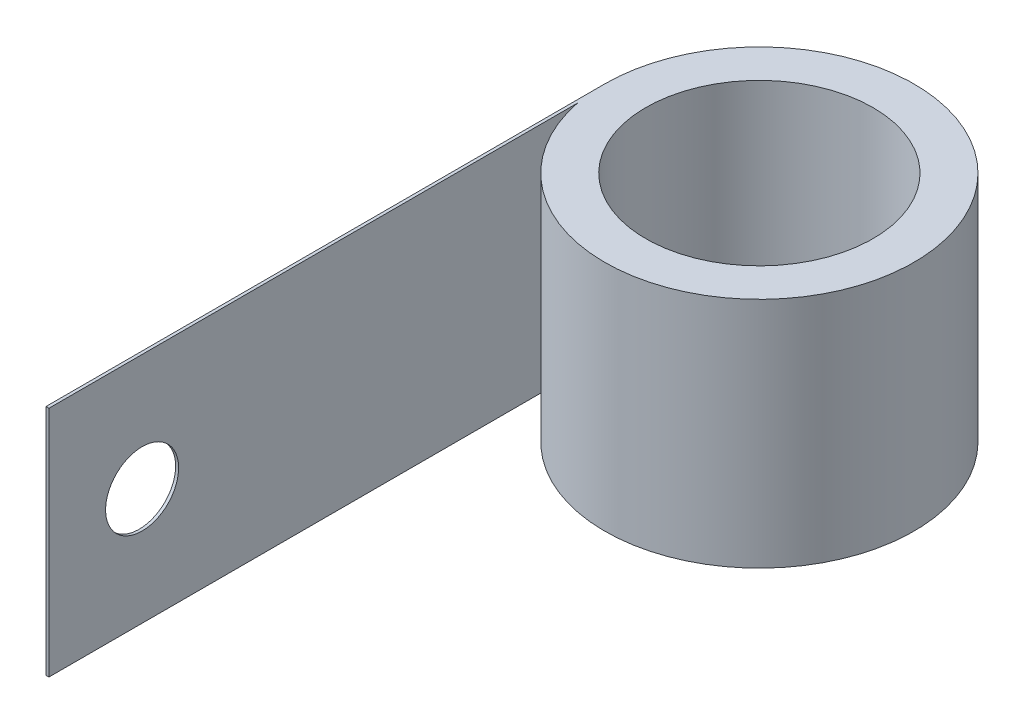
ISO-10303-21;
HEADER;
FILE_DESCRIPTION(('STEP AP214'),'2;1');
FILE_NAME('part.step','',(''),(''),'','','');
FILE_SCHEMA(('AUTOMOTIVE_DESIGN { 1 0 10303 214 1 1 1 1 }'));
ENDSEC;
DATA;
#1=APPLICATION_CONTEXT('core data for automotive mechanical design processes');
#2=APPLICATION_PROTOCOL_DEFINITION('international standard','automotive_design',2000,#1);
#3=PRODUCT_CONTEXT('',#1,'mechanical');
#4=PRODUCT('Part','Part','',(#3));
#5=PRODUCT_RELATED_PRODUCT_CATEGORY('part','',(#4));
#6=PRODUCT_DEFINITION_FORMATION('','',#4);
#7=PRODUCT_DEFINITION_CONTEXT('part definition',#1,'design');
#8=PRODUCT_DEFINITION('design','',#6,#7);
#9=PRODUCT_DEFINITION_SHAPE('','',#8);
#10=(LENGTH_UNIT() NAMED_UNIT(*) SI_UNIT(.MILLI.,.METRE.));
#11=(NAMED_UNIT(*) PLANE_ANGLE_UNIT() SI_UNIT($,.RADIAN.));
#12=(NAMED_UNIT(*) SI_UNIT($,.STERADIAN.) SOLID_ANGLE_UNIT());
#13=UNCERTAINTY_MEASURE_WITH_UNIT(LENGTH_MEASURE(1.E-05),#10,'distance_accuracy_value','');
#14=(GEOMETRIC_REPRESENTATION_CONTEXT(3) GLOBAL_UNCERTAINTY_ASSIGNED_CONTEXT((#13)) GLOBAL_UNIT_ASSIGNED_CONTEXT((#10,
#11,#12)) REPRESENTATION_CONTEXT('',''));
#15=CARTESIAN_POINT('',(0.,0.,0.));
#16=DIRECTION('',(0.,0.,1.));
#17=DIRECTION('',(1.,0.,0.));
#18=AXIS2_PLACEMENT_3D('',#15,#16,#17);
#19=CARTESIAN_POINT('',(0.,15.875,0.));
#20=DIRECTION('',(0.,-1.,0.));
#21=DIRECTION('',(0.,0.,-1.));
#22=AXIS2_PLACEMENT_3D('',#19,#20,#21);
#23=CYLINDRICAL_SURFACE('',#22,7.747);
#24=CARTESIAN_POINT('',(0.,0.,0.));
#25=DIRECTION('',(0.,-1.,0.));
#26=DIRECTION('',(0.,0.,-1.));
#27=AXIS2_PLACEMENT_3D('',#24,#25,#26);
#28=CIRCLE('',#27,7.747);
#29=CARTESIAN_POINT('',(0.,0.,-7.747));
#30=VERTEX_POINT('',#29);
#31=EDGE_CURVE('E88',#30,#30,#28,.T.);
#32=ORIENTED_EDGE('',*,*,#31,.T.);
#33=EDGE_LOOP('',(#32));
#34=FACE_BOUND('',#33,.T.);
#35=CARTESIAN_POINT('',(0.,15.875,0.));
#36=DIRECTION('',(0.,-1.,0.));
#37=DIRECTION('',(0.,0.,-1.));
#38=AXIS2_PLACEMENT_3D('',#35,#36,#37);
#39=CIRCLE('',#38,7.747);
#40=CARTESIAN_POINT('',(0.,15.875,-7.747));
#41=VERTEX_POINT('',#40);
#42=EDGE_CURVE('E120',#41,#41,#39,.T.);
#43=ORIENTED_EDGE('',*,*,#42,.F.);
#44=EDGE_LOOP('',(#43));
#45=FACE_BOUND('',#44,.T.);
#46=ADVANCED_FACE('F16',(#34,#45),#23,.F.);
#47=CARTESIAN_POINT('',(-10.541,7.9375,31.75));
#48=DIRECTION('',(1.,0.,0.));
#49=DIRECTION('',(0.,0.,-1.));
#50=AXIS2_PLACEMENT_3D('',#47,#48,#49);
#51=CYLINDRICAL_SURFACE('',#50,2.4892);
#52=CARTESIAN_POINT('',(-10.3378,7.9375,31.75));
#53=DIRECTION('',(1.,0.,0.));
#54=DIRECTION('',(0.,0.,-1.));
#55=AXIS2_PLACEMENT_3D('',#52,#53,#54);
#56=CIRCLE('',#55,2.4892);
#57=CARTESIAN_POINT('',(-10.3378,7.9375,29.2608));
#58=VERTEX_POINT('',#57);
#59=EDGE_CURVE('E115',#58,#58,#56,.T.);
#60=ORIENTED_EDGE('',*,*,#59,.T.);
#61=EDGE_LOOP('',(#60));
#62=FACE_BOUND('',#61,.T.);
#63=CARTESIAN_POINT('',(-10.541,7.9375,31.75));
#64=DIRECTION('',(1.,0.,0.));
#65=DIRECTION('',(0.,0.,-1.));
#66=AXIS2_PLACEMENT_3D('',#63,#64,#65);
#67=CIRCLE('',#66,2.4892);
#68=CARTESIAN_POINT('',(-10.541,7.9375,29.2608));
#69=VERTEX_POINT('',#68);
#70=EDGE_CURVE('E82',#69,#69,#67,.F.);
#71=ORIENTED_EDGE('',*,*,#70,.T.);
#72=EDGE_LOOP('',(#71));
#73=FACE_BOUND('',#72,.T.);
#74=ADVANCED_FACE('F160',(#62,#73),#51,.F.);
#75=CARTESIAN_POINT('',(-10.541,15.875,38.1));
#76=DIRECTION('',(0.,0.,-1.));
#77=DIRECTION('',(-1.,0.,0.));
#78=AXIS2_PLACEMENT_3D('',#75,#76,#77);
#79=PLANE('',#78);
#80=DIRECTION('',(0.,1.,0.));
#81=VECTOR('',#80,1.);
#82=CARTESIAN_POINT('',(-10.3378,15.875,38.1));
#83=LINE('',#82,#81);
#84=CARTESIAN_POINT('',(-10.3378,0.,38.1));
#85=VERTEX_POINT('',#84);
#86=CARTESIAN_POINT('',(-10.3378,15.875,38.1));
#87=VERTEX_POINT('',#86);
#88=EDGE_CURVE('E64',#85,#87,#83,.T.);
#89=ORIENTED_EDGE('',*,*,#88,.T.);
#90=DIRECTION('',(1.,0.,0.));
#91=VECTOR('',#90,1.);
#92=CARTESIAN_POINT('',(0.,15.875,38.1));
#93=LINE('',#92,#91);
#94=CARTESIAN_POINT('',(-10.541,15.875,38.1));
#95=VERTEX_POINT('',#94);
#96=EDGE_CURVE('E76',#95,#87,#93,.T.);
#97=ORIENTED_EDGE('',*,*,#96,.F.);
#98=DIRECTION('',(0.,1.,0.));
#99=VECTOR('',#98,1.);
#100=CARTESIAN_POINT('',(-10.541,15.875,38.1));
#101=LINE('',#100,#99);
#102=CARTESIAN_POINT('',(-10.541,0.,38.1));
#103=VERTEX_POINT('',#102);
#104=EDGE_CURVE('E72',#95,#103,#101,.F.);
#105=ORIENTED_EDGE('',*,*,#104,.T.);
#106=DIRECTION('',(1.,0.,0.));
#107=VECTOR('',#106,1.);
#108=CARTESIAN_POINT('',(0.,0.,38.1));
#109=LINE('',#108,#107);
#110=EDGE_CURVE('E75',#103,#85,#109,.T.);
#111=ORIENTED_EDGE('',*,*,#110,.T.);
#112=EDGE_LOOP('',(#89,#97,#105,#111));
#113=FACE_BOUND('',#112,.T.);
#114=ADVANCED_FACE('F74',(#113),#79,.F.);
#115=CARTESIAN_POINT('',(0.,0.,0.));
#116=DIRECTION('',(0.,1.,0.));
#117=DIRECTION('',(0.,0.,1.));
#118=AXIS2_PLACEMENT_3D('',#115,#116,#117);
#119=PLANE('',#118);
#120=ORIENTED_EDGE('',*,*,#31,.F.);
#121=EDGE_LOOP('',(#120));
#122=FACE_BOUND('',#121,.T.);
#123=DIRECTION('',(0.,0.,1.));
#124=VECTOR('',#123,1.);
#125=CARTESIAN_POINT('',(-10.3378,0.,38.1));
#126=LINE('',#125,#124);
#127=CARTESIAN_POINT('',(-10.3378,0.,2.05975050916371));
#128=VERTEX_POINT('',#127);
#129=EDGE_CURVE('E86',#128,#85,#126,.T.);
#130=ORIENTED_EDGE('',*,*,#129,.T.);
#131=ORIENTED_EDGE('',*,*,#110,.F.);
#132=DIRECTION('',(0.,0.,-1.));
#133=VECTOR('',#132,1.);
#134=CARTESIAN_POINT('',(-10.541,0.,0.));
#135=LINE('',#134,#133);
#136=CARTESIAN_POINT('',(-10.541,0.,0.));
#137=VERTEX_POINT('',#136);
#138=EDGE_CURVE('E81',#103,#137,#135,.T.);
#139=ORIENTED_EDGE('',*,*,#138,.T.);
#140=CARTESIAN_POINT('',(0.,0.,0.));
#141=DIRECTION('',(0.,-1.,0.));
#142=DIRECTION('',(0.,0.,-1.));
#143=AXIS2_PLACEMENT_3D('',#140,#141,#142);
#144=CIRCLE('',#143,10.541);
#145=EDGE_CURVE('E52',#128,#137,#144,.F.);
#146=ORIENTED_EDGE('',*,*,#145,.F.);
#147=EDGE_LOOP('',(#130,#131,#139,#146));
#148=FACE_BOUND('',#147,.T.);
#149=ADVANCED_FACE('F84',(#122,#148),#119,.F.);
#150=CARTESIAN_POINT('',(-10.541,15.875,0.));
#151=DIRECTION('',(1.,0.,0.));
#152=DIRECTION('',(0.,0.,-1.));
#153=AXIS2_PLACEMENT_3D('',#150,#151,#152);
#154=PLANE('',#153);
#155=ORIENTED_EDGE('',*,*,#104,.F.);
#156=DIRECTION('',(0.,0.,1.));
#157=VECTOR('',#156,1.);
#158=CARTESIAN_POINT('',(-10.541,15.875,0.));
#159=LINE('',#158,#157);
#160=CARTESIAN_POINT('',(-10.541,15.875,0.));
#161=VERTEX_POINT('',#160);
#162=EDGE_CURVE('E95',#161,#95,#159,.T.);
#163=ORIENTED_EDGE('',*,*,#162,.F.);
#164=DIRECTION('',(0.,-1.,0.));
#165=VECTOR('',#164,1.);
#166=CARTESIAN_POINT('',(-10.541,15.875,0.));
#167=LINE('',#166,#165);
#168=EDGE_CURVE('E93',#137,#161,#167,.F.);
#169=ORIENTED_EDGE('',*,*,#168,.F.);
#170=ORIENTED_EDGE('',*,*,#138,.F.);
#171=EDGE_LOOP('',(#155,#163,#169,#170));
#172=FACE_BOUND('',#171,.T.);
#173=ORIENTED_EDGE('',*,*,#70,.F.);
#174=EDGE_LOOP('',(#173));
#175=FACE_BOUND('',#174,.T.);
#176=ADVANCED_FACE('F90',(#172,#175),#154,.F.);
#177=CARTESIAN_POINT('',(0.,15.875,0.));
#178=DIRECTION('',(0.,1.,0.));
#179=DIRECTION('',(0.,0.,1.));
#180=AXIS2_PLACEMENT_3D('',#177,#178,#179);
#181=PLANE('',#180);
#182=ORIENTED_EDGE('',*,*,#42,.T.);
#183=EDGE_LOOP('',(#182));
#184=FACE_BOUND('',#183,.T.);
#185=ORIENTED_EDGE('',*,*,#96,.T.);
#186=DIRECTION('',(0.,0.,1.));
#187=VECTOR('',#186,1.);
#188=CARTESIAN_POINT('',(-10.3378,15.875,38.1));
#189=LINE('',#188,#187);
#190=CARTESIAN_POINT('',(-10.3378,15.875,2.05975050916371));
#191=VERTEX_POINT('',#190);
#192=EDGE_CURVE('E39',#87,#191,#189,.F.);
#193=ORIENTED_EDGE('',*,*,#192,.T.);
#194=CARTESIAN_POINT('',(0.,15.875,0.));
#195=DIRECTION('',(0.,-1.,0.));
#196=DIRECTION('',(0.,0.,-1.));
#197=AXIS2_PLACEMENT_3D('',#194,#195,#196);
#198=CIRCLE('',#197,10.541);
#199=EDGE_CURVE('E26',#161,#191,#198,.T.);
#200=ORIENTED_EDGE('',*,*,#199,.F.);
#201=ORIENTED_EDGE('',*,*,#162,.T.);
#202=EDGE_LOOP('',(#185,#193,#200,#201));
#203=FACE_BOUND('',#202,.T.);
#204=ADVANCED_FACE('F157',(#184,#203),#181,.T.);
#205=CARTESIAN_POINT('',(-10.3378,15.875,38.1));
#206=DIRECTION('',(-1.,0.,0.));
#207=DIRECTION('',(0.,0.,1.));
#208=AXIS2_PLACEMENT_3D('',#205,#206,#207);
#209=PLANE('',#208);
#210=DIRECTION('',(0.,-1.,0.));
#211=VECTOR('',#210,1.);
#212=CARTESIAN_POINT('',(-10.3378,15.875,2.05975050916371));
#213=LINE('',#212,#211);
#214=EDGE_CURVE('E11',#191,#128,#213,.T.);
#215=ORIENTED_EDGE('',*,*,#214,.F.);
#216=ORIENTED_EDGE('',*,*,#192,.F.);
#217=ORIENTED_EDGE('',*,*,#88,.F.);
#218=ORIENTED_EDGE('',*,*,#129,.F.);
#219=EDGE_LOOP('',(#215,#216,#217,#218));
#220=FACE_BOUND('',#219,.T.);
#221=ORIENTED_EDGE('',*,*,#59,.F.);
#222=EDGE_LOOP('',(#221));
#223=FACE_BOUND('',#222,.T.);
#224=ADVANCED_FACE('F164',(#220,#223),#209,.F.);
#225=CARTESIAN_POINT('',(0.,15.875,0.));
#226=DIRECTION('',(0.,-1.,0.));
#227=DIRECTION('',(0.,0.,-1.));
#228=AXIS2_PLACEMENT_3D('',#225,#226,#227);
#229=CYLINDRICAL_SURFACE('',#228,10.541);
#230=ORIENTED_EDGE('',*,*,#199,.T.);
#231=ORIENTED_EDGE('',*,*,#214,.T.);
#232=ORIENTED_EDGE('',*,*,#145,.T.);
#233=ORIENTED_EDGE('',*,*,#168,.T.);
#234=EDGE_LOOP('',(#230,#231,#232,#233));
#235=FACE_BOUND('',#234,.T.);
#236=ADVANCED_FACE('F162',(#235),#229,.T.);
#237=CLOSED_SHELL('',(#46,#74,#114,#149,#176,#204,#224,#236));
#238=MANIFOLD_SOLID_BREP('B1',#237);
#239=ADVANCED_BREP_SHAPE_REPRESENTATION('',(#18,#238),#14);
#240=SHAPE_DEFINITION_REPRESENTATION(#9,#239);
ENDSEC;
END-ISO-10303-21;
